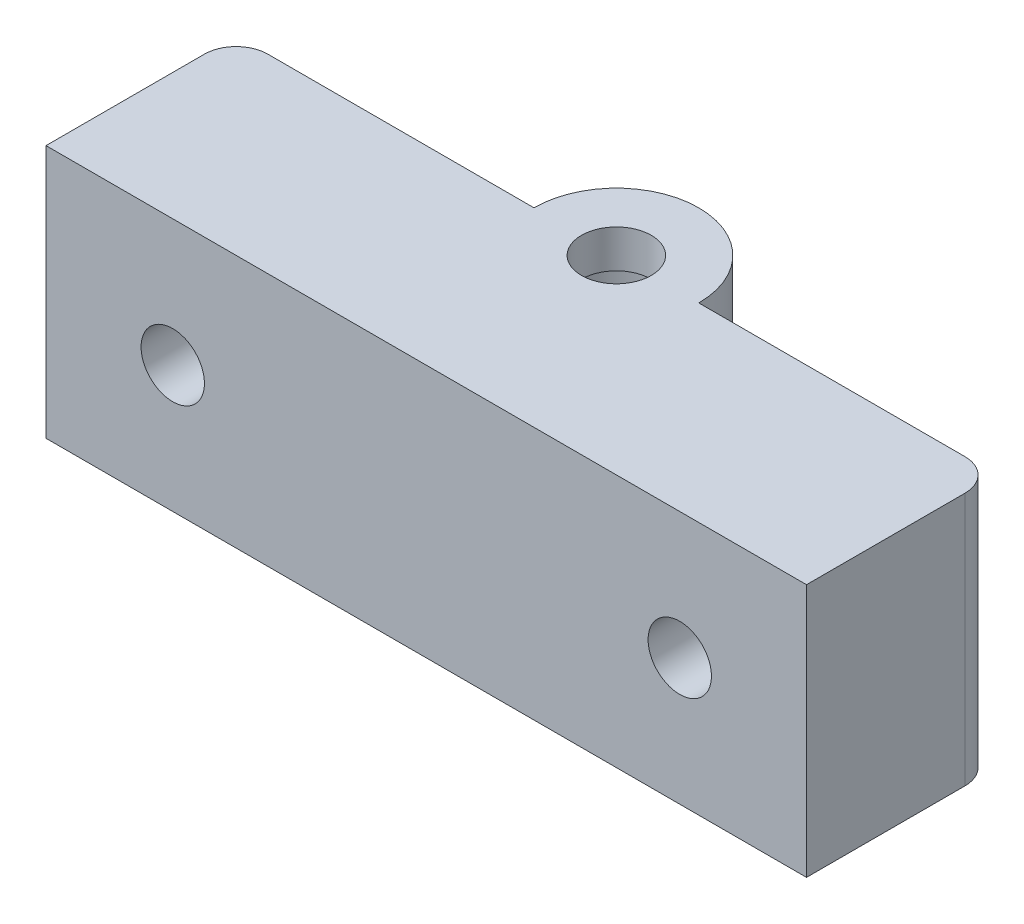
ISO-10303-21;
HEADER;
FILE_DESCRIPTION(('STEP AP214'),'2;1');
FILE_NAME('part.step','',(''),(''),'','','');
FILE_SCHEMA(('AUTOMOTIVE_DESIGN { 1 0 10303 214 1 1 1 1 }'));
ENDSEC;
DATA;
#1=APPLICATION_CONTEXT('core data for automotive mechanical design processes');
#2=APPLICATION_PROTOCOL_DEFINITION('international standard','automotive_design',2000,#1);
#3=PRODUCT_CONTEXT('',#1,'mechanical');
#4=PRODUCT('Part','Part','',(#3));
#5=PRODUCT_RELATED_PRODUCT_CATEGORY('part','',(#4));
#6=PRODUCT_DEFINITION_FORMATION('','',#4);
#7=PRODUCT_DEFINITION_CONTEXT('part definition',#1,'design');
#8=PRODUCT_DEFINITION('design','',#6,#7);
#9=PRODUCT_DEFINITION_SHAPE('','',#8);
#10=(LENGTH_UNIT() NAMED_UNIT(*) SI_UNIT(.MILLI.,.METRE.));
#11=(NAMED_UNIT(*) PLANE_ANGLE_UNIT() SI_UNIT($,.RADIAN.));
#12=(NAMED_UNIT(*) SI_UNIT($,.STERADIAN.) SOLID_ANGLE_UNIT());
#13=UNCERTAINTY_MEASURE_WITH_UNIT(LENGTH_MEASURE(1.E-05),#10,'distance_accuracy_value','');
#14=(GEOMETRIC_REPRESENTATION_CONTEXT(3) GLOBAL_UNCERTAINTY_ASSIGNED_CONTEXT((#13)) GLOBAL_UNIT_ASSIGNED_CONTEXT((#10,
#11,#12)) REPRESENTATION_CONTEXT('',''));
#15=CARTESIAN_POINT('',(0.,0.,0.));
#16=DIRECTION('',(0.,0.,1.));
#17=DIRECTION('',(1.,0.,0.));
#18=AXIS2_PLACEMENT_3D('',#15,#16,#17);
#19=CARTESIAN_POINT('',(0.,20.,0.));
#20=DIRECTION('',(0.,-1.,0.));
#21=DIRECTION('',(0.,0.,-1.));
#22=AXIS2_PLACEMENT_3D('',#19,#20,#21);
#23=CYLINDRICAL_SURFACE('',#22,2.75);
#24=CARTESIAN_POINT('',(0.,20.,0.));
#25=DIRECTION('',(0.,1.,0.));
#26=DIRECTION('',(0.,0.,1.));
#27=AXIS2_PLACEMENT_3D('',#24,#25,#26);
#28=CIRCLE('',#27,2.75);
#29=CARTESIAN_POINT('',(0.,20.,2.75));
#30=VERTEX_POINT('',#29);
#31=EDGE_CURVE('E136',#30,#30,#28,.T.);
#32=ORIENTED_EDGE('',*,*,#31,.T.);
#33=EDGE_LOOP('',(#32));
#34=FACE_BOUND('',#33,.T.);
#35=CARTESIAN_POINT('',(0.,17.,0.));
#36=DIRECTION('',(0.,-1.,0.));
#37=DIRECTION('',(0.,0.,-1.));
#38=AXIS2_PLACEMENT_3D('',#35,#36,#37);
#39=CIRCLE('',#38,2.75);
#40=CARTESIAN_POINT('',(0.,17.,-2.75));
#41=VERTEX_POINT('',#40);
#42=EDGE_CURVE('E197',#41,#41,#39,.F.);
#43=ORIENTED_EDGE('',*,*,#42,.F.);
#44=EDGE_LOOP('',(#43));
#45=FACE_BOUND('',#44,.T.);
#46=ADVANCED_FACE('F33',(#34,#45),#23,.F.);
#47=CARTESIAN_POINT('',(-30.,20.,15.));
#48=DIRECTION('',(0.,0.,-1.));
#49=DIRECTION('',(-1.,0.,0.));
#50=AXIS2_PLACEMENT_3D('',#47,#48,#49);
#51=PLANE('',#50);
#52=DIRECTION('',(1.,0.,0.));
#53=VECTOR('',#52,1.);
#54=CARTESIAN_POINT('',(-30.,0.,15.));
#55=LINE('',#54,#53);
#56=CARTESIAN_POINT('',(-30.,0.,15.));
#57=VERTEX_POINT('',#56);
#58=CARTESIAN_POINT('',(30.,0.,15.));
#59=VERTEX_POINT('',#58);
#60=EDGE_CURVE('E142',#57,#59,#55,.T.);
#61=ORIENTED_EDGE('',*,*,#60,.T.);
#62=DIRECTION('',(0.,-1.,0.));
#63=VECTOR('',#62,1.);
#64=CARTESIAN_POINT('',(30.,20.,15.));
#65=LINE('',#64,#63);
#66=CARTESIAN_POINT('',(30.,20.,15.));
#67=VERTEX_POINT('',#66);
#68=EDGE_CURVE('E123',#67,#59,#65,.T.);
#69=ORIENTED_EDGE('',*,*,#68,.F.);
#70=DIRECTION('',(1.,0.,0.));
#71=VECTOR('',#70,1.);
#72=CARTESIAN_POINT('',(-30.,20.,15.));
#73=LINE('',#72,#71);
#74=CARTESIAN_POINT('',(-30.,20.,15.));
#75=VERTEX_POINT('',#74);
#76=EDGE_CURVE('E114',#75,#67,#73,.T.);
#77=ORIENTED_EDGE('',*,*,#76,.F.);
#78=DIRECTION('',(0.,-1.,0.));
#79=VECTOR('',#78,1.);
#80=CARTESIAN_POINT('',(-30.,20.,15.));
#81=LINE('',#80,#79);
#82=EDGE_CURVE('E151',#75,#57,#81,.T.);
#83=ORIENTED_EDGE('',*,*,#82,.T.);
#84=EDGE_LOOP('',(#61,#69,#77,#83));
#85=FACE_BOUND('',#84,.T.);
#86=CARTESIAN_POINT('',(-20.,10.,15.));
#87=DIRECTION('',(0.,0.,-1.));
#88=DIRECTION('',(-1.,0.,0.));
#89=AXIS2_PLACEMENT_3D('',#86,#87,#88);
#90=CIRCLE('',#89,2.5);
#91=CARTESIAN_POINT('',(-22.5,10.,15.));
#92=VERTEX_POINT('',#91);
#93=EDGE_CURVE('E37',#92,#92,#90,.F.);
#94=ORIENTED_EDGE('',*,*,#93,.F.);
#95=EDGE_LOOP('',(#94));
#96=FACE_BOUND('',#95,.T.);
#97=CARTESIAN_POINT('',(20.,10.,15.));
#98=DIRECTION('',(0.,0.,-1.));
#99=DIRECTION('',(-1.,0.,0.));
#100=AXIS2_PLACEMENT_3D('',#97,#98,#99);
#101=CIRCLE('',#100,2.5);
#102=CARTESIAN_POINT('',(17.5,10.,15.));
#103=VERTEX_POINT('',#102);
#104=EDGE_CURVE('E184',#103,#103,#101,.T.);
#105=ORIENTED_EDGE('',*,*,#104,.T.);
#106=EDGE_LOOP('',(#105));
#107=FACE_BOUND('',#106,.T.);
#108=ADVANCED_FACE('F174',(#85,#96,#107),#51,.F.);
#109=CARTESIAN_POINT('',(0.,20.,0.));
#110=DIRECTION('',(0.,-1.,0.));
#111=DIRECTION('',(0.,0.,-1.));
#112=AXIS2_PLACEMENT_3D('',#109,#110,#111);
#113=PLANE('',#112);
#114=CARTESIAN_POINT('',(0.,20.,0.));
#115=DIRECTION('',(0.,1.,0.));
#116=DIRECTION('',(0.,0.,-1.));
#117=AXIS2_PLACEMENT_3D('',#114,#115,#116);
#118=CIRCLE('',#117,6.5);
#119=CARTESIAN_POINT('',(6.5,20.,0.));
#120=VERTEX_POINT('',#119);
#121=CARTESIAN_POINT('',(-6.5,20.,0.));
#122=VERTEX_POINT('',#121);
#123=EDGE_CURVE('E147',#120,#122,#118,.T.);
#124=ORIENTED_EDGE('',*,*,#123,.T.);
#125=DIRECTION('',(-1.,0.,0.));
#126=VECTOR('',#125,1.);
#127=CARTESIAN_POINT('',(-6.5,20.,0.));
#128=LINE('',#127,#126);
#129=CARTESIAN_POINT('',(-27.5,20.,0.));
#130=VERTEX_POINT('',#129);
#131=EDGE_CURVE('E94',#122,#130,#128,.T.);
#132=ORIENTED_EDGE('',*,*,#131,.T.);
#133=CARTESIAN_POINT('',(-27.5,20.,2.5));
#134=DIRECTION('',(0.,1.,0.));
#135=DIRECTION('',(0.,0.,1.));
#136=AXIS2_PLACEMENT_3D('',#133,#134,#135);
#137=CIRCLE('',#136,2.5);
#138=CARTESIAN_POINT('',(-30.,20.,2.50000000000002));
#139=VERTEX_POINT('',#138);
#140=EDGE_CURVE('E163',#130,#139,#137,.T.);
#141=ORIENTED_EDGE('',*,*,#140,.T.);
#142=DIRECTION('',(0.,0.,1.));
#143=VECTOR('',#142,1.);
#144=CARTESIAN_POINT('',(-30.,20.,2.50000000000002));
#145=LINE('',#144,#143);
#146=EDGE_CURVE('E176',#139,#75,#145,.T.);
#147=ORIENTED_EDGE('',*,*,#146,.T.);
#148=ORIENTED_EDGE('',*,*,#76,.T.);
#149=DIRECTION('',(0.,0.,-1.));
#150=VECTOR('',#149,1.);
#151=CARTESIAN_POINT('',(30.,20.,15.));
#152=LINE('',#151,#150);
#153=CARTESIAN_POINT('',(30.,20.,2.50000000000002));
#154=VERTEX_POINT('',#153);
#155=EDGE_CURVE('E107',#67,#154,#152,.T.);
#156=ORIENTED_EDGE('',*,*,#155,.T.);
#157=CARTESIAN_POINT('',(27.5,20.,2.5));
#158=DIRECTION('',(0.,1.,0.));
#159=DIRECTION('',(0.,0.,1.));
#160=AXIS2_PLACEMENT_3D('',#157,#158,#159);
#161=CIRCLE('',#160,2.5);
#162=CARTESIAN_POINT('',(27.5,20.,0.));
#163=VERTEX_POINT('',#162);
#164=EDGE_CURVE('E112',#154,#163,#161,.T.);
#165=ORIENTED_EDGE('',*,*,#164,.T.);
#166=DIRECTION('',(-1.,0.,0.));
#167=VECTOR('',#166,1.);
#168=CARTESIAN_POINT('',(27.5,20.,0.));
#169=LINE('',#168,#167);
#170=EDGE_CURVE('E51',#163,#120,#169,.T.);
#171=ORIENTED_EDGE('',*,*,#170,.T.);
#172=EDGE_LOOP('',(#124,#132,#141,#147,#148,#156,#165,#171));
#173=FACE_BOUND('',#172,.T.);
#174=ORIENTED_EDGE('',*,*,#31,.F.);
#175=EDGE_LOOP('',(#174));
#176=FACE_BOUND('',#175,.T.);
#177=ADVANCED_FACE('F109',(#173,#176),#113,.F.);
#178=CARTESIAN_POINT('',(0.,0.,0.));
#179=DIRECTION('',(0.,-1.,0.));
#180=DIRECTION('',(0.,0.,-1.));
#181=AXIS2_PLACEMENT_3D('',#178,#179,#180);
#182=PLANE('',#181);
#183=CARTESIAN_POINT('',(0.,0.,0.));
#184=DIRECTION('',(0.,-1.,0.));
#185=DIRECTION('',(0.,0.,-1.));
#186=AXIS2_PLACEMENT_3D('',#183,#184,#185);
#187=CIRCLE('',#186,5.);
#188=CARTESIAN_POINT('',(0.,0.,-5.));
#189=VERTEX_POINT('',#188);
#190=EDGE_CURVE('E194',#189,#189,#187,.T.);
#191=ORIENTED_EDGE('',*,*,#190,.F.);
#192=EDGE_LOOP('',(#191));
#193=FACE_BOUND('',#192,.T.);
#194=CARTESIAN_POINT('',(0.,0.,0.));
#195=DIRECTION('',(0.,1.,0.));
#196=DIRECTION('',(0.,0.,-1.));
#197=AXIS2_PLACEMENT_3D('',#194,#195,#196);
#198=CIRCLE('',#197,6.5);
#199=CARTESIAN_POINT('',(6.5,0.,0.));
#200=VERTEX_POINT('',#199);
#201=CARTESIAN_POINT('',(-6.5,0.,0.));
#202=VERTEX_POINT('',#201);
#203=EDGE_CURVE('E132',#200,#202,#198,.T.);
#204=ORIENTED_EDGE('',*,*,#203,.F.);
#205=DIRECTION('',(-1.,0.,0.));
#206=VECTOR('',#205,1.);
#207=CARTESIAN_POINT('',(27.5,0.,0.));
#208=LINE('',#207,#206);
#209=CARTESIAN_POINT('',(27.5,0.,0.));
#210=VERTEX_POINT('',#209);
#211=EDGE_CURVE('E86',#210,#200,#208,.T.);
#212=ORIENTED_EDGE('',*,*,#211,.F.);
#213=CARTESIAN_POINT('',(27.5,0.,2.5));
#214=DIRECTION('',(0.,1.,0.));
#215=DIRECTION('',(0.,0.,1.));
#216=AXIS2_PLACEMENT_3D('',#213,#214,#215);
#217=CIRCLE('',#216,2.5);
#218=CARTESIAN_POINT('',(30.,0.,2.50000000000002));
#219=VERTEX_POINT('',#218);
#220=EDGE_CURVE('E80',#219,#210,#217,.T.);
#221=ORIENTED_EDGE('',*,*,#220,.F.);
#222=DIRECTION('',(0.,0.,-1.));
#223=VECTOR('',#222,1.);
#224=CARTESIAN_POINT('',(30.,0.,15.));
#225=LINE('',#224,#223);
#226=EDGE_CURVE('E122',#59,#219,#225,.T.);
#227=ORIENTED_EDGE('',*,*,#226,.F.);
#228=ORIENTED_EDGE('',*,*,#60,.F.);
#229=DIRECTION('',(0.,0.,1.));
#230=VECTOR('',#229,1.);
#231=CARTESIAN_POINT('',(-30.,0.,2.50000000000002));
#232=LINE('',#231,#230);
#233=CARTESIAN_POINT('',(-30.,0.,2.50000000000002));
#234=VERTEX_POINT('',#233);
#235=EDGE_CURVE('E140',#234,#57,#232,.T.);
#236=ORIENTED_EDGE('',*,*,#235,.F.);
#237=CARTESIAN_POINT('',(-27.5,0.,2.5));
#238=DIRECTION('',(0.,1.,0.));
#239=DIRECTION('',(0.,0.,1.));
#240=AXIS2_PLACEMENT_3D('',#237,#238,#239);
#241=CIRCLE('',#240,2.5);
#242=CARTESIAN_POINT('',(-27.5,0.,0.));
#243=VERTEX_POINT('',#242);
#244=EDGE_CURVE('E138',#243,#234,#241,.T.);
#245=ORIENTED_EDGE('',*,*,#244,.F.);
#246=DIRECTION('',(-1.,0.,0.));
#247=VECTOR('',#246,1.);
#248=CARTESIAN_POINT('',(-6.5,0.,0.));
#249=LINE('',#248,#247);
#250=EDGE_CURVE('E135',#202,#243,#249,.T.);
#251=ORIENTED_EDGE('',*,*,#250,.F.);
#252=EDGE_LOOP('',(#204,#212,#221,#227,#228,#236,#245,#251));
#253=FACE_BOUND('',#252,.T.);
#254=ADVANCED_FACE('F167',(#193,#253),#182,.T.);
#255=CARTESIAN_POINT('',(0.,20.,0.));
#256=DIRECTION('',(0.,-1.,0.));
#257=DIRECTION('',(0.,0.,-1.));
#258=AXIS2_PLACEMENT_3D('',#255,#256,#257);
#259=CYLINDRICAL_SURFACE('',#258,6.5);
#260=ORIENTED_EDGE('',*,*,#203,.T.);
#261=DIRECTION('',(0.,-1.,0.));
#262=VECTOR('',#261,1.);
#263=CARTESIAN_POINT('',(-6.5,20.,0.));
#264=LINE('',#263,#262);
#265=EDGE_CURVE('E11',#122,#202,#264,.T.);
#266=ORIENTED_EDGE('',*,*,#265,.F.);
#267=ORIENTED_EDGE('',*,*,#123,.F.);
#268=DIRECTION('',(0.,-1.,0.));
#269=VECTOR('',#268,1.);
#270=CARTESIAN_POINT('',(6.5,20.,0.));
#271=LINE('',#270,#269);
#272=EDGE_CURVE('E128',#120,#200,#271,.T.);
#273=ORIENTED_EDGE('',*,*,#272,.T.);
#274=EDGE_LOOP('',(#260,#266,#267,#273));
#275=FACE_BOUND('',#274,.T.);
#276=ADVANCED_FACE('F35',(#275),#259,.T.);
#277=CARTESIAN_POINT('',(-6.5,20.,0.));
#278=DIRECTION('',(0.,0.,1.));
#279=DIRECTION('',(1.,0.,0.));
#280=AXIS2_PLACEMENT_3D('',#277,#278,#279);
#281=PLANE('',#280);
#282=CARTESIAN_POINT('',(-20.,10.,0.));
#283=DIRECTION('',(0.,0.,1.));
#284=DIRECTION('',(1.,0.,0.));
#285=AXIS2_PLACEMENT_3D('',#282,#283,#284);
#286=CIRCLE('',#285,2.5);
#287=CARTESIAN_POINT('',(-17.5,10.,0.));
#288=VERTEX_POINT('',#287);
#289=EDGE_CURVE('E188',#288,#288,#286,.T.);
#290=ORIENTED_EDGE('',*,*,#289,.T.);
#291=EDGE_LOOP('',(#290));
#292=FACE_BOUND('',#291,.T.);
#293=ORIENTED_EDGE('',*,*,#250,.T.);
#294=DIRECTION('',(0.,-1.,0.));
#295=VECTOR('',#294,1.);
#296=CARTESIAN_POINT('',(-27.5,20.,0.));
#297=LINE('',#296,#295);
#298=EDGE_CURVE('E43',#130,#243,#297,.T.);
#299=ORIENTED_EDGE('',*,*,#298,.F.);
#300=ORIENTED_EDGE('',*,*,#131,.F.);
#301=ORIENTED_EDGE('',*,*,#265,.T.);
#302=EDGE_LOOP('',(#293,#299,#300,#301));
#303=FACE_BOUND('',#302,.T.);
#304=ADVANCED_FACE('F234',(#292,#303),#281,.F.);
#305=CARTESIAN_POINT('',(-27.5,20.,2.5));
#306=DIRECTION('',(0.,-1.,0.));
#307=DIRECTION('',(0.,0.,-1.));
#308=AXIS2_PLACEMENT_3D('',#305,#306,#307);
#309=CYLINDRICAL_SURFACE('',#308,2.5);
#310=ORIENTED_EDGE('',*,*,#244,.T.);
#311=DIRECTION('',(0.,-1.,0.));
#312=VECTOR('',#311,1.);
#313=CARTESIAN_POINT('',(-30.,20.,2.50000000000002));
#314=LINE('',#313,#312);
#315=EDGE_CURVE('E154',#139,#234,#314,.T.);
#316=ORIENTED_EDGE('',*,*,#315,.F.);
#317=ORIENTED_EDGE('',*,*,#140,.F.);
#318=ORIENTED_EDGE('',*,*,#298,.T.);
#319=EDGE_LOOP('',(#310,#316,#317,#318));
#320=FACE_BOUND('',#319,.T.);
#321=ADVANCED_FACE('F161',(#320),#309,.T.);
#322=CARTESIAN_POINT('',(-30.,20.,2.50000000000002));
#323=DIRECTION('',(1.,0.,0.));
#324=DIRECTION('',(0.,0.,-1.));
#325=AXIS2_PLACEMENT_3D('',#322,#323,#324);
#326=PLANE('',#325);
#327=ORIENTED_EDGE('',*,*,#235,.T.);
#328=ORIENTED_EDGE('',*,*,#82,.F.);
#329=ORIENTED_EDGE('',*,*,#146,.F.);
#330=ORIENTED_EDGE('',*,*,#315,.T.);
#331=EDGE_LOOP('',(#327,#328,#329,#330));
#332=FACE_BOUND('',#331,.T.);
#333=ADVANCED_FACE('F171',(#332),#326,.F.);
#334=CARTESIAN_POINT('',(30.,20.,15.));
#335=DIRECTION('',(-1.,0.,0.));
#336=DIRECTION('',(0.,0.,1.));
#337=AXIS2_PLACEMENT_3D('',#334,#335,#336);
#338=PLANE('',#337);
#339=ORIENTED_EDGE('',*,*,#226,.T.);
#340=DIRECTION('',(0.,-1.,0.));
#341=VECTOR('',#340,1.);
#342=CARTESIAN_POINT('',(30.,20.,2.50000000000002));
#343=LINE('',#342,#341);
#344=EDGE_CURVE('E119',#154,#219,#343,.T.);
#345=ORIENTED_EDGE('',*,*,#344,.F.);
#346=ORIENTED_EDGE('',*,*,#155,.F.);
#347=ORIENTED_EDGE('',*,*,#68,.T.);
#348=EDGE_LOOP('',(#339,#345,#346,#347));
#349=FACE_BOUND('',#348,.T.);
#350=ADVANCED_FACE('F120',(#349),#338,.F.);
#351=CARTESIAN_POINT('',(27.5,20.,2.5));
#352=DIRECTION('',(0.,-1.,0.));
#353=DIRECTION('',(0.,0.,-1.));
#354=AXIS2_PLACEMENT_3D('',#351,#352,#353);
#355=CYLINDRICAL_SURFACE('',#354,2.5);
#356=ORIENTED_EDGE('',*,*,#220,.T.);
#357=DIRECTION('',(0.,-1.,0.));
#358=VECTOR('',#357,1.);
#359=CARTESIAN_POINT('',(27.5,20.,0.));
#360=LINE('',#359,#358);
#361=EDGE_CURVE('E124',#163,#210,#360,.T.);
#362=ORIENTED_EDGE('',*,*,#361,.F.);
#363=ORIENTED_EDGE('',*,*,#164,.F.);
#364=ORIENTED_EDGE('',*,*,#344,.T.);
#365=EDGE_LOOP('',(#356,#362,#363,#364));
#366=FACE_BOUND('',#365,.T.);
#367=ADVANCED_FACE('F126',(#366),#355,.T.);
#368=CARTESIAN_POINT('',(27.5,20.,0.));
#369=DIRECTION('',(0.,0.,1.));
#370=DIRECTION('',(1.,0.,0.));
#371=AXIS2_PLACEMENT_3D('',#368,#369,#370);
#372=PLANE('',#371);
#373=CARTESIAN_POINT('',(20.,10.,0.));
#374=DIRECTION('',(0.,0.,-1.));
#375=DIRECTION('',(-1.,0.,0.));
#376=AXIS2_PLACEMENT_3D('',#373,#374,#375);
#377=CIRCLE('',#376,2.5);
#378=CARTESIAN_POINT('',(17.5,10.,0.));
#379=VERTEX_POINT('',#378);
#380=EDGE_CURVE('E187',#379,#379,#377,.T.);
#381=ORIENTED_EDGE('',*,*,#380,.F.);
#382=EDGE_LOOP('',(#381));
#383=FACE_BOUND('',#382,.T.);
#384=ORIENTED_EDGE('',*,*,#211,.T.);
#385=ORIENTED_EDGE('',*,*,#272,.F.);
#386=ORIENTED_EDGE('',*,*,#170,.F.);
#387=ORIENTED_EDGE('',*,*,#361,.T.);
#388=EDGE_LOOP('',(#384,#385,#386,#387));
#389=FACE_BOUND('',#388,.T.);
#390=ADVANCED_FACE('F222',(#383,#389),#372,.F.);
#391=CARTESIAN_POINT('',(20.,10.,20.));
#392=DIRECTION('',(0.,0.,-1.));
#393=DIRECTION('',(-1.,0.,0.));
#394=AXIS2_PLACEMENT_3D('',#391,#392,#393);
#395=CYLINDRICAL_SURFACE('',#394,2.5);
#396=ORIENTED_EDGE('',*,*,#380,.T.);
#397=EDGE_LOOP('',(#396));
#398=FACE_BOUND('',#397,.T.);
#399=ORIENTED_EDGE('',*,*,#104,.F.);
#400=EDGE_LOOP('',(#399));
#401=FACE_BOUND('',#400,.T.);
#402=ADVANCED_FACE('F225',(#398,#401),#395,.F.);
#403=CARTESIAN_POINT('',(-20.,10.,20.));
#404=DIRECTION('',(0.,0.,-1.));
#405=DIRECTION('',(-1.,0.,0.));
#406=AXIS2_PLACEMENT_3D('',#403,#404,#405);
#407=CYLINDRICAL_SURFACE('',#406,2.5);
#408=ORIENTED_EDGE('',*,*,#289,.F.);
#409=EDGE_LOOP('',(#408));
#410=FACE_BOUND('',#409,.T.);
#411=ORIENTED_EDGE('',*,*,#93,.T.);
#412=EDGE_LOOP('',(#411));
#413=FACE_BOUND('',#412,.T.);
#414=ADVANCED_FACE('F215',(#410,#413),#407,.F.);
#415=CARTESIAN_POINT('',(0.,17.,0.));
#416=DIRECTION('',(0.,-1.,0.));
#417=DIRECTION('',(0.,0.,-1.));
#418=AXIS2_PLACEMENT_3D('',#415,#416,#417);
#419=CYLINDRICAL_SURFACE('',#418,5.);
#420=CARTESIAN_POINT('',(0.,17.,0.));
#421=DIRECTION('',(0.,-1.,0.));
#422=DIRECTION('',(0.,0.,-1.));
#423=AXIS2_PLACEMENT_3D('',#420,#421,#422);
#424=CIRCLE('',#423,5.);
#425=CARTESIAN_POINT('',(0.,17.,-5.));
#426=VERTEX_POINT('',#425);
#427=EDGE_CURVE('E191',#426,#426,#424,.T.);
#428=ORIENTED_EDGE('',*,*,#427,.F.);
#429=EDGE_LOOP('',(#428));
#430=FACE_BOUND('',#429,.T.);
#431=ORIENTED_EDGE('',*,*,#190,.T.);
#432=EDGE_LOOP('',(#431));
#433=FACE_BOUND('',#432,.T.);
#434=ADVANCED_FACE('F247',(#430,#433),#419,.F.);
#435=CARTESIAN_POINT('',(0.,17.,0.));
#436=DIRECTION('',(0.,-1.,0.));
#437=DIRECTION('',(0.,0.,-1.));
#438=AXIS2_PLACEMENT_3D('',#435,#436,#437);
#439=PLANE('',#438);
#440=ORIENTED_EDGE('',*,*,#42,.T.);
#441=EDGE_LOOP('',(#440));
#442=FACE_BOUND('',#441,.T.);
#443=ORIENTED_EDGE('',*,*,#427,.T.);
#444=EDGE_LOOP('',(#443));
#445=FACE_BOUND('',#444,.T.);
#446=ADVANCED_FACE('F203',(#442,#445),#439,.T.);
#447=CLOSED_SHELL('',(#46,#108,#177,#254,#276,#304,#321,#333,#350,#367,#390,#402,#414,#434,#446));
#448=MANIFOLD_SOLID_BREP('B2',#447);
#449=ADVANCED_BREP_SHAPE_REPRESENTATION('',(#18,#448),#14);
#450=SHAPE_DEFINITION_REPRESENTATION(#9,#449);
ENDSEC;
END-ISO-10303-21;
